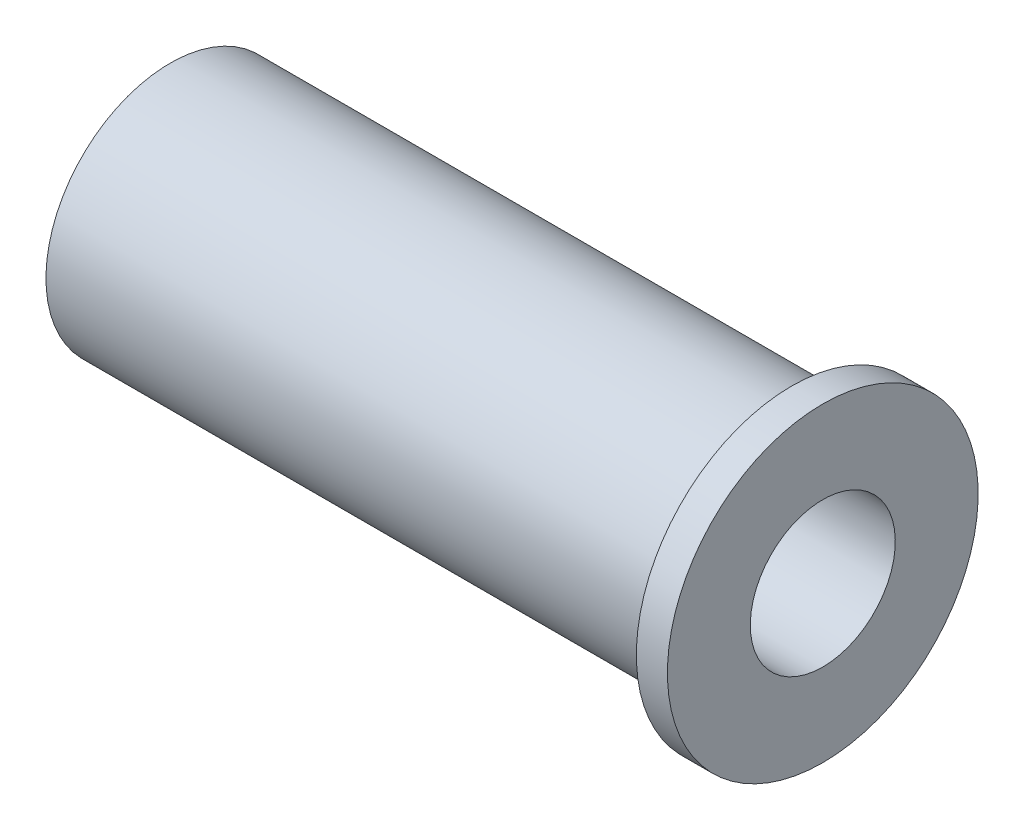
ISO-10303-21;
HEADER;
FILE_DESCRIPTION(('STEP AP214'),'2;1');
FILE_NAME('part.step','',(''),(''),'','','');
FILE_SCHEMA(('AUTOMOTIVE_DESIGN { 1 0 10303 214 1 1 1 1 }'));
ENDSEC;
DATA;
#1=APPLICATION_CONTEXT('core data for automotive mechanical design processes');
#2=APPLICATION_PROTOCOL_DEFINITION('international standard','automotive_design',2000,#1);
#3=PRODUCT_CONTEXT('',#1,'mechanical');
#4=PRODUCT('Part','Part','',(#3));
#5=PRODUCT_RELATED_PRODUCT_CATEGORY('part','',(#4));
#6=PRODUCT_DEFINITION_FORMATION('','',#4);
#7=PRODUCT_DEFINITION_CONTEXT('part definition',#1,'design');
#8=PRODUCT_DEFINITION('design','',#6,#7);
#9=PRODUCT_DEFINITION_SHAPE('','',#8);
#10=(LENGTH_UNIT() NAMED_UNIT(*) SI_UNIT(.MILLI.,.METRE.));
#11=(NAMED_UNIT(*) PLANE_ANGLE_UNIT() SI_UNIT($,.RADIAN.));
#12=(NAMED_UNIT(*) SI_UNIT($,.STERADIAN.) SOLID_ANGLE_UNIT());
#13=UNCERTAINTY_MEASURE_WITH_UNIT(LENGTH_MEASURE(1.E-05),#10,'distance_accuracy_value','');
#14=(GEOMETRIC_REPRESENTATION_CONTEXT(3) GLOBAL_UNCERTAINTY_ASSIGNED_CONTEXT((#13)) GLOBAL_UNIT_ASSIGNED_CONTEXT((#10,
#11,#12)) REPRESENTATION_CONTEXT('',''));
#15=CARTESIAN_POINT('',(0.,0.,0.));
#16=DIRECTION('',(0.,0.,1.));
#17=DIRECTION('',(1.,0.,0.));
#18=AXIS2_PLACEMENT_3D('',#15,#16,#17);
#19=CARTESIAN_POINT('',(0.,0.,0.));
#20=DIRECTION('',(-1.,0.,0.));
#21=DIRECTION('',(0.,-1.,0.));
#22=AXIS2_PLACEMENT_3D('',#19,#20,#21);
#23=CYLINDRICAL_SURFACE('',#22,15.);
#24=CARTESIAN_POINT('',(60.,0.,0.));
#25=DIRECTION('',(-1.,0.,0.));
#26=DIRECTION('',(0.,-1.,0.));
#27=AXIS2_PLACEMENT_3D('',#24,#25,#26);
#28=CIRCLE('',#27,15.);
#29=CARTESIAN_POINT('',(60.,-15.,0.));
#30=VERTEX_POINT('',#29);
#31=EDGE_CURVE('E63',#30,#30,#28,.T.);
#32=ORIENTED_EDGE('',*,*,#31,.F.);
#33=EDGE_LOOP('',(#32));
#34=FACE_BOUND('',#33,.T.);
#35=CARTESIAN_POINT('',(63.,0.,0.));
#36=DIRECTION('',(-1.,0.,0.));
#37=DIRECTION('',(0.,-1.,0.));
#38=AXIS2_PLACEMENT_3D('',#35,#36,#37);
#39=CIRCLE('',#38,15.);
#40=CARTESIAN_POINT('',(63.,-15.,0.));
#41=VERTEX_POINT('',#40);
#42=EDGE_CURVE('E10',#41,#41,#39,.T.);
#43=ORIENTED_EDGE('',*,*,#42,.T.);
#44=EDGE_LOOP('',(#43));
#45=FACE_BOUND('',#44,.T.);
#46=ADVANCED_FACE('F41',(#34,#45),#23,.T.);
#47=CARTESIAN_POINT('',(63.,15.,0.));
#48=DIRECTION('',(-1.,0.,0.));
#49=DIRECTION('',(0.,-1.,0.));
#50=AXIS2_PLACEMENT_3D('',#47,#48,#49);
#51=PLANE('',#50);
#52=ORIENTED_EDGE('',*,*,#42,.F.);
#53=EDGE_LOOP('',(#52));
#54=FACE_BOUND('',#53,.T.);
#55=CARTESIAN_POINT('',(63.,0.,0.));
#56=DIRECTION('',(-1.,0.,0.));
#57=DIRECTION('',(0.,-1.,0.));
#58=AXIS2_PLACEMENT_3D('',#55,#56,#57);
#59=CIRCLE('',#58,7.);
#60=CARTESIAN_POINT('',(63.,-7.,0.));
#61=VERTEX_POINT('',#60);
#62=EDGE_CURVE('E47',#61,#61,#59,.T.);
#63=ORIENTED_EDGE('',*,*,#62,.T.);
#64=EDGE_LOOP('',(#63));
#65=FACE_BOUND('',#64,.T.);
#66=ADVANCED_FACE('F70',(#54,#65),#51,.F.);
#67=CARTESIAN_POINT('',(0.,0.,0.));
#68=DIRECTION('',(-1.,0.,0.));
#69=DIRECTION('',(0.,-1.,0.));
#70=AXIS2_PLACEMENT_3D('',#67,#68,#69);
#71=CYLINDRICAL_SURFACE('',#70,7.);
#72=ORIENTED_EDGE('',*,*,#62,.F.);
#73=EDGE_LOOP('',(#72));
#74=FACE_BOUND('',#73,.T.);
#75=CARTESIAN_POINT('',(0.,0.,0.));
#76=DIRECTION('',(-1.,0.,0.));
#77=DIRECTION('',(0.,-1.,0.));
#78=AXIS2_PLACEMENT_3D('',#75,#76,#77);
#79=CIRCLE('',#78,7.);
#80=CARTESIAN_POINT('',(0.,-7.,0.));
#81=VERTEX_POINT('',#80);
#82=EDGE_CURVE('E51',#81,#81,#79,.T.);
#83=ORIENTED_EDGE('',*,*,#82,.T.);
#84=EDGE_LOOP('',(#83));
#85=FACE_BOUND('',#84,.T.);
#86=ADVANCED_FACE('F74',(#74,#85),#71,.F.);
#87=CARTESIAN_POINT('',(0.,7.,0.));
#88=DIRECTION('',(1.,0.,0.));
#89=DIRECTION('',(0.,1.,0.));
#90=AXIS2_PLACEMENT_3D('',#87,#88,#89);
#91=PLANE('',#90);
#92=ORIENTED_EDGE('',*,*,#82,.F.);
#93=EDGE_LOOP('',(#92));
#94=FACE_BOUND('',#93,.T.);
#95=CARTESIAN_POINT('',(0.,0.,0.));
#96=DIRECTION('',(-1.,0.,0.));
#97=DIRECTION('',(0.,-1.,0.));
#98=AXIS2_PLACEMENT_3D('',#95,#96,#97);
#99=CIRCLE('',#98,12.);
#100=CARTESIAN_POINT('',(0.,-12.,0.));
#101=VERTEX_POINT('',#100);
#102=EDGE_CURVE('E55',#101,#101,#99,.T.);
#103=ORIENTED_EDGE('',*,*,#102,.T.);
#104=EDGE_LOOP('',(#103));
#105=FACE_BOUND('',#104,.T.);
#106=ADVANCED_FACE('F80',(#94,#105),#91,.F.);
#107=CARTESIAN_POINT('',(0.,0.,0.));
#108=DIRECTION('',(-1.,0.,0.));
#109=DIRECTION('',(0.,-1.,0.));
#110=AXIS2_PLACEMENT_3D('',#107,#108,#109);
#111=CYLINDRICAL_SURFACE('',#110,12.);
#112=ORIENTED_EDGE('',*,*,#102,.F.);
#113=EDGE_LOOP('',(#112));
#114=FACE_BOUND('',#113,.T.);
#115=CARTESIAN_POINT('',(60.,0.,0.));
#116=DIRECTION('',(-1.,0.,0.));
#117=DIRECTION('',(0.,-1.,0.));
#118=AXIS2_PLACEMENT_3D('',#115,#116,#117);
#119=CIRCLE('',#118,12.);
#120=CARTESIAN_POINT('',(60.,-12.,0.));
#121=VERTEX_POINT('',#120);
#122=EDGE_CURVE('E60',#121,#121,#119,.T.);
#123=ORIENTED_EDGE('',*,*,#122,.T.);
#124=EDGE_LOOP('',(#123));
#125=FACE_BOUND('',#124,.T.);
#126=ADVANCED_FACE('F86',(#114,#125),#111,.T.);
#127=CARTESIAN_POINT('',(60.,12.,0.));
#128=DIRECTION('',(1.,0.,0.));
#129=DIRECTION('',(0.,1.,0.));
#130=AXIS2_PLACEMENT_3D('',#127,#128,#129);
#131=PLANE('',#130);
#132=ORIENTED_EDGE('',*,*,#122,.F.);
#133=EDGE_LOOP('',(#132));
#134=FACE_BOUND('',#133,.T.);
#135=ORIENTED_EDGE('',*,*,#31,.T.);
#136=EDGE_LOOP('',(#135));
#137=FACE_BOUND('',#136,.T.);
#138=ADVANCED_FACE('F67',(#134,#137),#131,.F.);
#139=CLOSED_SHELL('',(#46,#66,#86,#106,#126,#138));
#140=MANIFOLD_SOLID_BREP('B2',#139);
#141=ADVANCED_BREP_SHAPE_REPRESENTATION('',(#18,#140),#14);
#142=SHAPE_DEFINITION_REPRESENTATION(#9,#141);
ENDSEC;
END-ISO-10303-21;
